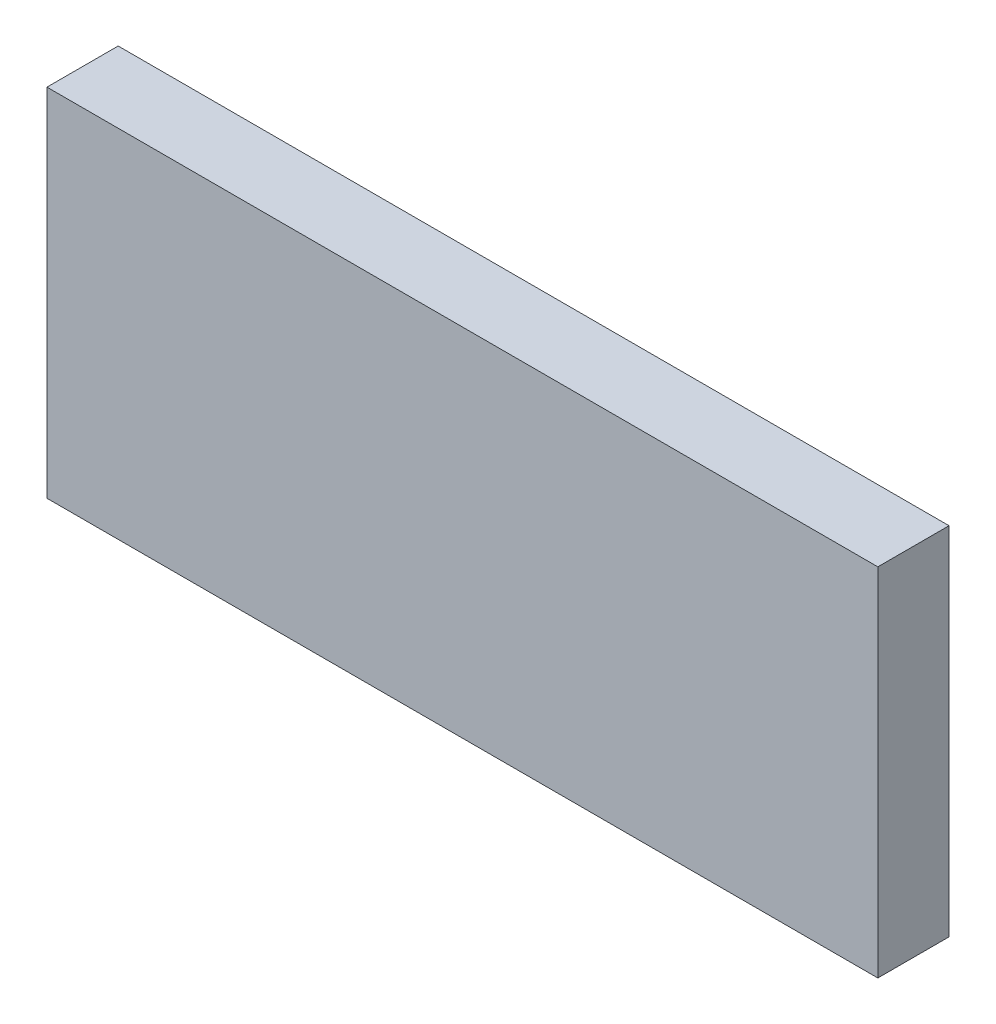
ISO-10303-21;
HEADER;
FILE_DESCRIPTION(('STEP AP214'),'2;1');
FILE_NAME('part.step','',(''),(''),'','','');
FILE_SCHEMA(('AUTOMOTIVE_DESIGN { 1 0 10303 214 1 1 1 1 }'));
ENDSEC;
DATA;
#1=APPLICATION_CONTEXT('core data for automotive mechanical design processes');
#2=APPLICATION_PROTOCOL_DEFINITION('international standard','automotive_design',2000,#1);
#3=PRODUCT_CONTEXT('',#1,'mechanical');
#4=PRODUCT('Part','Part','',(#3));
#5=PRODUCT_RELATED_PRODUCT_CATEGORY('part','',(#4));
#6=PRODUCT_DEFINITION_FORMATION('','',#4);
#7=PRODUCT_DEFINITION_CONTEXT('part definition',#1,'design');
#8=PRODUCT_DEFINITION('design','',#6,#7);
#9=PRODUCT_DEFINITION_SHAPE('','',#8);
#10=(LENGTH_UNIT() NAMED_UNIT(*) SI_UNIT(.MILLI.,.METRE.));
#11=(NAMED_UNIT(*) PLANE_ANGLE_UNIT() SI_UNIT($,.RADIAN.));
#12=(NAMED_UNIT(*) SI_UNIT($,.STERADIAN.) SOLID_ANGLE_UNIT());
#13=UNCERTAINTY_MEASURE_WITH_UNIT(LENGTH_MEASURE(1.E-05),#10,'distance_accuracy_value','');
#14=(GEOMETRIC_REPRESENTATION_CONTEXT(3) GLOBAL_UNCERTAINTY_ASSIGNED_CONTEXT((#13)) GLOBAL_UNIT_ASSIGNED_CONTEXT((#10,
#11,#12)) REPRESENTATION_CONTEXT('',''));
#15=CARTESIAN_POINT('',(0.,0.,0.));
#16=DIRECTION('',(0.,0.,1.));
#17=DIRECTION('',(1.,0.,0.));
#18=AXIS2_PLACEMENT_3D('',#15,#16,#17);
#19=CARTESIAN_POINT('',(0.,0.,15.));
#20=DIRECTION('',(1.,0.,0.));
#21=DIRECTION('',(0.,0.,-1.));
#22=AXIS2_PLACEMENT_3D('',#19,#20,#21);
#23=PLANE('',#22);
#24=DIRECTION('',(0.,-1.,0.));
#25=VECTOR('',#24,1.);
#26=CARTESIAN_POINT('',(0.,0.,0.));
#27=LINE('',#26,#25);
#28=CARTESIAN_POINT('',(0.,75.,0.));
#29=VERTEX_POINT('',#28);
#30=CARTESIAN_POINT('',(0.,0.,0.));
#31=VERTEX_POINT('',#30);
#32=EDGE_CURVE('E102',#29,#31,#27,.T.);
#33=ORIENTED_EDGE('',*,*,#32,.T.);
#34=DIRECTION('',(0.,0.,-1.));
#35=VECTOR('',#34,1.);
#36=CARTESIAN_POINT('',(0.,0.,15.));
#37=LINE('',#36,#35);
#38=CARTESIAN_POINT('',(0.,0.,15.));
#39=VERTEX_POINT('',#38);
#40=EDGE_CURVE('E11',#39,#31,#37,.T.);
#41=ORIENTED_EDGE('',*,*,#40,.F.);
#42=DIRECTION('',(0.,-1.,0.));
#43=VECTOR('',#42,1.);
#44=CARTESIAN_POINT('',(0.,0.,15.));
#45=LINE('',#44,#43);
#46=CARTESIAN_POINT('',(0.,75.,15.));
#47=VERTEX_POINT('',#46);
#48=EDGE_CURVE('E95',#47,#39,#45,.T.);
#49=ORIENTED_EDGE('',*,*,#48,.F.);
#50=DIRECTION('',(0.,0.,-1.));
#51=VECTOR('',#50,1.);
#52=CARTESIAN_POINT('',(0.,75.,15.));
#53=LINE('',#52,#51);
#54=EDGE_CURVE('E99',#47,#29,#53,.T.);
#55=ORIENTED_EDGE('',*,*,#54,.T.);
#56=EDGE_LOOP('',(#33,#41,#49,#55));
#57=FACE_BOUND('',#56,.T.);
#58=ADVANCED_FACE('F41',(#57),#23,.F.);
#59=CARTESIAN_POINT('',(0.,0.,15.));
#60=DIRECTION('',(0.,1.,0.));
#61=DIRECTION('',(0.,0.,1.));
#62=AXIS2_PLACEMENT_3D('',#59,#60,#61);
#63=PLANE('',#62);
#64=DIRECTION('',(1.,0.,0.));
#65=VECTOR('',#64,1.);
#66=CARTESIAN_POINT('',(0.,0.,0.));
#67=LINE('',#66,#65);
#68=CARTESIAN_POINT('',(175.,0.,0.));
#69=VERTEX_POINT('',#68);
#70=EDGE_CURVE('E96',#31,#69,#67,.T.);
#71=ORIENTED_EDGE('',*,*,#70,.T.);
#72=DIRECTION('',(0.,0.,-1.));
#73=VECTOR('',#72,1.);
#74=CARTESIAN_POINT('',(175.,0.,15.));
#75=LINE('',#74,#73);
#76=CARTESIAN_POINT('',(175.,0.,15.));
#77=VERTEX_POINT('',#76);
#78=EDGE_CURVE('E47',#77,#69,#75,.T.);
#79=ORIENTED_EDGE('',*,*,#78,.F.);
#80=DIRECTION('',(1.,0.,0.));
#81=VECTOR('',#80,1.);
#82=CARTESIAN_POINT('',(0.,0.,15.));
#83=LINE('',#82,#81);
#84=EDGE_CURVE('E87',#39,#77,#83,.T.);
#85=ORIENTED_EDGE('',*,*,#84,.F.);
#86=ORIENTED_EDGE('',*,*,#40,.T.);
#87=EDGE_LOOP('',(#71,#79,#85,#86));
#88=FACE_BOUND('',#87,.T.);
#89=ADVANCED_FACE('F92',(#88),#63,.F.);
#90=CARTESIAN_POINT('',(175.,0.,15.));
#91=DIRECTION('',(-1.,0.,0.));
#92=DIRECTION('',(0.,0.,1.));
#93=AXIS2_PLACEMENT_3D('',#90,#91,#92);
#94=PLANE('',#93);
#95=DIRECTION('',(0.,1.,0.));
#96=VECTOR('',#95,1.);
#97=CARTESIAN_POINT('',(175.,0.,0.));
#98=LINE('',#97,#96);
#99=CARTESIAN_POINT('',(175.,75.,0.));
#100=VERTEX_POINT('',#99);
#101=EDGE_CURVE('E74',#69,#100,#98,.T.);
#102=ORIENTED_EDGE('',*,*,#101,.T.);
#103=DIRECTION('',(0.,0.,-1.));
#104=VECTOR('',#103,1.);
#105=CARTESIAN_POINT('',(175.,75.,15.));
#106=LINE('',#105,#104);
#107=CARTESIAN_POINT('',(175.,75.,15.));
#108=VERTEX_POINT('',#107);
#109=EDGE_CURVE('E100',#108,#100,#106,.T.);
#110=ORIENTED_EDGE('',*,*,#109,.F.);
#111=DIRECTION('',(0.,1.,0.));
#112=VECTOR('',#111,1.);
#113=CARTESIAN_POINT('',(175.,0.,15.));
#114=LINE('',#113,#112);
#115=EDGE_CURVE('E89',#77,#108,#114,.T.);
#116=ORIENTED_EDGE('',*,*,#115,.F.);
#117=ORIENTED_EDGE('',*,*,#78,.T.);
#118=EDGE_LOOP('',(#102,#110,#116,#117));
#119=FACE_BOUND('',#118,.T.);
#120=ADVANCED_FACE('F98',(#119),#94,.F.);
#121=CARTESIAN_POINT('',(0.,75.,15.));
#122=DIRECTION('',(0.,-1.,0.));
#123=DIRECTION('',(0.,0.,-1.));
#124=AXIS2_PLACEMENT_3D('',#121,#122,#123);
#125=PLANE('',#124);
#126=DIRECTION('',(-1.,0.,0.));
#127=VECTOR('',#126,1.);
#128=CARTESIAN_POINT('',(0.,75.,0.));
#129=LINE('',#128,#127);
#130=EDGE_CURVE('E77',#100,#29,#129,.T.);
#131=ORIENTED_EDGE('',*,*,#130,.T.);
#132=ORIENTED_EDGE('',*,*,#54,.F.);
#133=DIRECTION('',(-1.,0.,0.));
#134=VECTOR('',#133,1.);
#135=CARTESIAN_POINT('',(0.,75.,15.));
#136=LINE('',#135,#134);
#137=EDGE_CURVE('E60',#108,#47,#136,.T.);
#138=ORIENTED_EDGE('',*,*,#137,.F.);
#139=ORIENTED_EDGE('',*,*,#109,.T.);
#140=EDGE_LOOP('',(#131,#132,#138,#139));
#141=FACE_BOUND('',#140,.T.);
#142=ADVANCED_FACE('F112',(#141),#125,.F.);
#143=CARTESIAN_POINT('',(0.,0.,15.));
#144=DIRECTION('',(0.,0.,-1.));
#145=DIRECTION('',(-1.,0.,0.));
#146=AXIS2_PLACEMENT_3D('',#143,#144,#145);
#147=PLANE('',#146);
#148=ORIENTED_EDGE('',*,*,#48,.T.);
#149=ORIENTED_EDGE('',*,*,#84,.T.);
#150=ORIENTED_EDGE('',*,*,#115,.T.);
#151=ORIENTED_EDGE('',*,*,#137,.T.);
#152=EDGE_LOOP('',(#148,#149,#150,#151));
#153=FACE_BOUND('',#152,.T.);
#154=ADVANCED_FACE('F86',(#153),#147,.F.);
#155=CARTESIAN_POINT('',(0.,0.,0.));
#156=DIRECTION('',(0.,0.,-1.));
#157=DIRECTION('',(-1.,0.,0.));
#158=AXIS2_PLACEMENT_3D('',#155,#156,#157);
#159=PLANE('',#158);
#160=ORIENTED_EDGE('',*,*,#32,.F.);
#161=ORIENTED_EDGE('',*,*,#130,.F.);
#162=ORIENTED_EDGE('',*,*,#101,.F.);
#163=ORIENTED_EDGE('',*,*,#70,.F.);
#164=EDGE_LOOP('',(#160,#161,#162,#163));
#165=FACE_BOUND('',#164,.T.);
#166=ADVANCED_FACE('F111',(#165),#159,.T.);
#167=CLOSED_SHELL('',(#58,#89,#120,#142,#154,#166));
#168=MANIFOLD_SOLID_BREP('B2',#167);
#169=ADVANCED_BREP_SHAPE_REPRESENTATION('',(#18,#168),#14);
#170=SHAPE_DEFINITION_REPRESENTATION(#9,#169);
ENDSEC;
END-ISO-10303-21;
